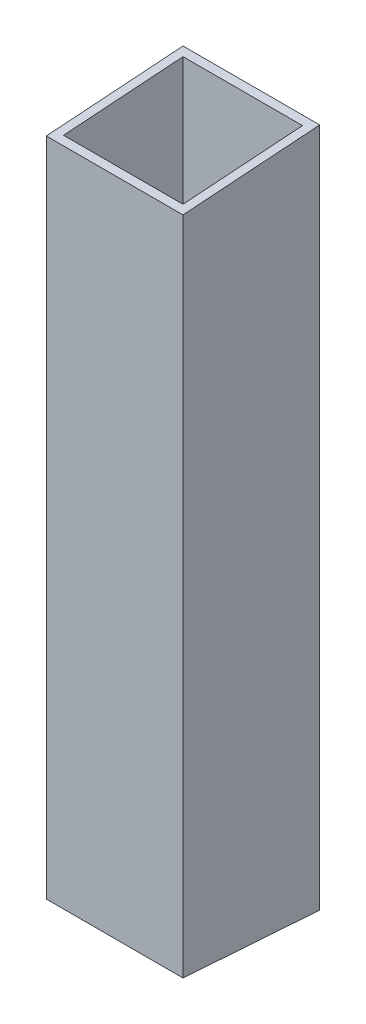
ISO-10303-21;
HEADER;
FILE_DESCRIPTION(('STEP AP214'),'2;1');
FILE_NAME('part.step','',(''),(''),'','','');
FILE_SCHEMA(('AUTOMOTIVE_DESIGN { 1 0 10303 214 1 1 1 1 }'));
ENDSEC;
DATA;
#1=APPLICATION_CONTEXT('core data for automotive mechanical design processes');
#2=APPLICATION_PROTOCOL_DEFINITION('international standard','automotive_design',2000,#1);
#3=PRODUCT_CONTEXT('',#1,'mechanical');
#4=PRODUCT('Part','Part','',(#3));
#5=PRODUCT_RELATED_PRODUCT_CATEGORY('part','',(#4));
#6=PRODUCT_DEFINITION_FORMATION('','',#4);
#7=PRODUCT_DEFINITION_CONTEXT('part definition',#1,'design');
#8=PRODUCT_DEFINITION('design','',#6,#7);
#9=PRODUCT_DEFINITION_SHAPE('','',#8);
#10=(LENGTH_UNIT() NAMED_UNIT(*) SI_UNIT(.MILLI.,.METRE.));
#11=(NAMED_UNIT(*) PLANE_ANGLE_UNIT() SI_UNIT($,.RADIAN.));
#12=(NAMED_UNIT(*) SI_UNIT($,.STERADIAN.) SOLID_ANGLE_UNIT());
#13=UNCERTAINTY_MEASURE_WITH_UNIT(LENGTH_MEASURE(1.E-05),#10,'distance_accuracy_value','');
#14=(GEOMETRIC_REPRESENTATION_CONTEXT(3) GLOBAL_UNCERTAINTY_ASSIGNED_CONTEXT((#13)) GLOBAL_UNIT_ASSIGNED_CONTEXT((#10,
#11,#12)) REPRESENTATION_CONTEXT('',''));
#15=CARTESIAN_POINT('',(0.,0.,0.));
#16=DIRECTION('',(0.,0.,1.));
#17=DIRECTION('',(1.,0.,0.));
#18=AXIS2_PLACEMENT_3D('',#15,#16,#17);
#19=CARTESIAN_POINT('',(9.525,92.1,9.525));
#20=DIRECTION('',(-1.,0.,0.));
#21=DIRECTION('',(0.,0.,1.));
#22=AXIS2_PLACEMENT_3D('',#19,#20,#21);
#23=PLANE('',#22);
#24=DIRECTION('',(0.,-1.,0.));
#25=VECTOR('',#24,1.);
#26=CARTESIAN_POINT('',(9.525,92.1,9.525));
#27=LINE('',#26,#25);
#28=CARTESIAN_POINT('',(9.525,92.1,9.525));
#29=VERTEX_POINT('',#28);
#30=CARTESIAN_POINT('',(9.525,0.,9.525));
#31=VERTEX_POINT('',#30);
#32=EDGE_CURVE('E161',#29,#31,#27,.T.);
#33=ORIENTED_EDGE('',*,*,#32,.T.);
#34=DIRECTION('',(0.,-0.0697564737441175,-0.997564050259825));
#35=VECTOR('',#34,1.);
#36=CARTESIAN_POINT('',(9.525,-1.33210576752373,-9.52500000000001));
#37=LINE('',#36,#35);
#38=CARTESIAN_POINT('',(9.525,-1.33210576752373,-9.52500000000001));
#39=VERTEX_POINT('',#38);
#40=EDGE_CURVE('E132',#31,#39,#37,.T.);
#41=ORIENTED_EDGE('',*,*,#40,.T.);
#42=DIRECTION('',(0.,-1.,0.));
#43=VECTOR('',#42,1.);
#44=CARTESIAN_POINT('',(9.525,92.1,-9.525));
#45=LINE('',#44,#43);
#46=CARTESIAN_POINT('',(9.525,93.4321057675237,-9.525));
#47=VERTEX_POINT('',#46);
#48=EDGE_CURVE('E175',#47,#39,#45,.T.);
#49=ORIENTED_EDGE('',*,*,#48,.F.);
#50=DIRECTION('',(0.,-0.069756473744119,0.997564050259825));
#51=VECTOR('',#50,1.);
#52=CARTESIAN_POINT('',(9.525,93.4321057675237,-9.525));
#53=LINE('',#52,#51);
#54=EDGE_CURVE('E144',#47,#29,#53,.T.);
#55=ORIENTED_EDGE('',*,*,#54,.T.);
#56=EDGE_LOOP('',(#33,#41,#49,#55));
#57=FACE_BOUND('',#56,.T.);
#58=ADVANCED_FACE('F39',(#57),#23,.F.);
#59=CARTESIAN_POINT('',(-9.525,92.1,-9.525));
#60=DIRECTION('',(0.,0.,1.));
#61=DIRECTION('',(1.,0.,0.));
#62=AXIS2_PLACEMENT_3D('',#59,#60,#61);
#63=PLANE('',#62);
#64=ORIENTED_EDGE('',*,*,#48,.T.);
#65=DIRECTION('',(1.,0.,0.));
#66=VECTOR('',#65,1.);
#67=CARTESIAN_POINT('',(-9.525,-1.33210576752373,-9.52500000000001));
#68=LINE('',#67,#66);
#69=CARTESIAN_POINT('',(-9.525,-1.33210576752373,-9.52500000000001));
#70=VERTEX_POINT('',#69);
#71=EDGE_CURVE('E137',#70,#39,#68,.T.);
#72=ORIENTED_EDGE('',*,*,#71,.F.);
#73=DIRECTION('',(0.,-1.,0.));
#74=VECTOR('',#73,1.);
#75=CARTESIAN_POINT('',(-9.525,92.1,-9.525));
#76=LINE('',#75,#74);
#77=CARTESIAN_POINT('',(-9.525,93.4321057675237,-9.525));
#78=VERTEX_POINT('',#77);
#79=EDGE_CURVE('E172',#78,#70,#76,.T.);
#80=ORIENTED_EDGE('',*,*,#79,.F.);
#81=DIRECTION('',(1.,0.,0.));
#82=VECTOR('',#81,1.);
#83=CARTESIAN_POINT('',(-9.525,93.4321057675237,-9.525));
#84=LINE('',#83,#82);
#85=EDGE_CURVE('E149',#78,#47,#84,.T.);
#86=ORIENTED_EDGE('',*,*,#85,.T.);
#87=EDGE_LOOP('',(#64,#72,#80,#86));
#88=FACE_BOUND('',#87,.T.);
#89=ADVANCED_FACE('F209',(#88),#63,.F.);
#90=CARTESIAN_POINT('',(-9.525,92.1,9.525));
#91=DIRECTION('',(1.,0.,0.));
#92=DIRECTION('',(0.,0.,-1.));
#93=AXIS2_PLACEMENT_3D('',#90,#91,#92);
#94=PLANE('',#93);
#95=ORIENTED_EDGE('',*,*,#79,.T.);
#96=DIRECTION('',(0.,-0.0697564737441175,-0.997564050259825));
#97=VECTOR('',#96,1.);
#98=CARTESIAN_POINT('',(-9.525,-1.33210576752373,-9.52500000000001));
#99=LINE('',#98,#97);
#100=CARTESIAN_POINT('',(-9.525,0.,9.525));
#101=VERTEX_POINT('',#100);
#102=EDGE_CURVE('E133',#101,#70,#99,.T.);
#103=ORIENTED_EDGE('',*,*,#102,.F.);
#104=DIRECTION('',(0.,-1.,0.));
#105=VECTOR('',#104,1.);
#106=CARTESIAN_POINT('',(-9.525,92.1,9.525));
#107=LINE('',#106,#105);
#108=CARTESIAN_POINT('',(-9.525,92.1,9.525));
#109=VERTEX_POINT('',#108);
#110=EDGE_CURVE('E168',#109,#101,#107,.T.);
#111=ORIENTED_EDGE('',*,*,#110,.F.);
#112=DIRECTION('',(0.,-0.069756473744119,0.997564050259825));
#113=VECTOR('',#112,1.);
#114=CARTESIAN_POINT('',(-9.525,93.4321057675237,-9.525));
#115=LINE('',#114,#113);
#116=EDGE_CURVE('E145',#78,#109,#115,.T.);
#117=ORIENTED_EDGE('',*,*,#116,.F.);
#118=EDGE_LOOP('',(#95,#103,#111,#117));
#119=FACE_BOUND('',#118,.T.);
#120=ADVANCED_FACE('F214',(#119),#94,.F.);
#121=CARTESIAN_POINT('',(-9.525,92.1,9.525));
#122=DIRECTION('',(0.,0.,-1.));
#123=DIRECTION('',(-1.,0.,0.));
#124=AXIS2_PLACEMENT_3D('',#121,#122,#123);
#125=PLANE('',#124);
#126=DIRECTION('',(1.,0.,0.));
#127=VECTOR('',#126,1.);
#128=CARTESIAN_POINT('',(-9.525,0.,9.525));
#129=LINE('',#128,#127);
#130=EDGE_CURVE('E156',#101,#31,#129,.T.);
#131=ORIENTED_EDGE('',*,*,#130,.T.);
#132=ORIENTED_EDGE('',*,*,#32,.F.);
#133=DIRECTION('',(1.,0.,0.));
#134=VECTOR('',#133,1.);
#135=CARTESIAN_POINT('',(-9.525,92.1,9.525));
#136=LINE('',#135,#134);
#137=EDGE_CURVE('E157',#109,#29,#136,.T.);
#138=ORIENTED_EDGE('',*,*,#137,.F.);
#139=ORIENTED_EDGE('',*,*,#110,.T.);
#140=EDGE_LOOP('',(#131,#132,#138,#139));
#141=FACE_BOUND('',#140,.T.);
#142=ADVANCED_FACE('F219',(#141),#125,.F.);
#143=CARTESIAN_POINT('',(-9.525,93.4321057675237,-9.525));
#144=DIRECTION('',(0.,0.997564050259825,0.069756473744119));
#145=DIRECTION('',(0.,-0.069756473744119,0.997564050259825));
#146=AXIS2_PLACEMENT_3D('',#143,#144,#145);
#147=PLANE('',#146);
#148=DIRECTION('',(1.,0.,0.));
#149=VECTOR('',#148,1.);
#150=CARTESIAN_POINT('',(-9.525,92.1839121743322,8.325));
#151=LINE('',#150,#149);
#152=CARTESIAN_POINT('',(-8.325,92.1839121743322,8.32500000000001));
#153=VERTEX_POINT('',#152);
#154=CARTESIAN_POINT('',(8.325,92.1839121743322,8.325));
#155=VERTEX_POINT('',#154);
#156=EDGE_CURVE('E126',#153,#155,#151,.T.);
#157=ORIENTED_EDGE('',*,*,#156,.F.);
#158=DIRECTION('',(0.,-0.069756473744119,0.997564050259825));
#159=VECTOR('',#158,1.);
#160=CARTESIAN_POINT('',(-8.325,93.4321057675237,-9.525));
#161=LINE('',#160,#159);
#162=CARTESIAN_POINT('',(-8.325,93.3481935931915,-8.325));
#163=VERTEX_POINT('',#162);
#164=EDGE_CURVE('E122',#163,#153,#161,.T.);
#165=ORIENTED_EDGE('',*,*,#164,.F.);
#166=DIRECTION('',(-1.,0.,0.));
#167=VECTOR('',#166,1.);
#168=CARTESIAN_POINT('',(-9.525,93.3481935931915,-8.325));
#169=LINE('',#168,#167);
#170=CARTESIAN_POINT('',(8.325,93.3481935931915,-8.325));
#171=VERTEX_POINT('',#170);
#172=EDGE_CURVE('E106',#171,#163,#169,.T.);
#173=ORIENTED_EDGE('',*,*,#172,.F.);
#174=DIRECTION('',(0.,0.069756473744119,-0.997564050259825));
#175=VECTOR('',#174,1.);
#176=CARTESIAN_POINT('',(8.325,93.4321057675237,-9.525));
#177=LINE('',#176,#175);
#178=EDGE_CURVE('E100',#155,#171,#177,.T.);
#179=ORIENTED_EDGE('',*,*,#178,.F.);
#180=EDGE_LOOP('',(#157,#165,#173,#179));
#181=FACE_BOUND('',#180,.T.);
#182=ORIENTED_EDGE('',*,*,#54,.F.);
#183=ORIENTED_EDGE('',*,*,#85,.F.);
#184=ORIENTED_EDGE('',*,*,#116,.T.);
#185=ORIENTED_EDGE('',*,*,#137,.T.);
#186=EDGE_LOOP('',(#182,#183,#184,#185));
#187=FACE_BOUND('',#186,.T.);
#188=ADVANCED_FACE('F120',(#181,#187),#147,.T.);
#189=CARTESIAN_POINT('',(-9.525,-1.33210576752373,-9.52500000000001));
#190=DIRECTION('',(0.,-0.997564050259825,0.0697564737441175));
#191=DIRECTION('',(0.,-0.0697564737441176,-0.997564050259825));
#192=AXIS2_PLACEMENT_3D('',#189,#190,#191);
#193=PLANE('',#192);
#194=DIRECTION('',(-1.,0.,0.));
#195=VECTOR('',#194,1.);
#196=CARTESIAN_POINT('',(-9.525,-0.083912174332203,8.32500000000001));
#197=LINE('',#196,#195);
#198=CARTESIAN_POINT('',(8.325,-0.0839121743322028,8.32500000000001));
#199=VERTEX_POINT('',#198);
#200=CARTESIAN_POINT('',(-8.325,-0.0839121743322028,8.32500000000001));
#201=VERTEX_POINT('',#200);
#202=EDGE_CURVE('E11',#199,#201,#197,.T.);
#203=ORIENTED_EDGE('',*,*,#202,.F.);
#204=DIRECTION('',(0.,0.0697564737441176,0.997564050259825));
#205=VECTOR('',#204,1.);
#206=CARTESIAN_POINT('',(8.325,-1.33210576752373,-9.52500000000001));
#207=LINE('',#206,#205);
#208=CARTESIAN_POINT('',(8.325,-1.24819359319152,-8.325));
#209=VERTEX_POINT('',#208);
#210=EDGE_CURVE('E178',#209,#199,#207,.T.);
#211=ORIENTED_EDGE('',*,*,#210,.F.);
#212=DIRECTION('',(1.,0.,0.));
#213=VECTOR('',#212,1.);
#214=CARTESIAN_POINT('',(-9.525,-1.24819359319152,-8.325));
#215=LINE('',#214,#213);
#216=CARTESIAN_POINT('',(-8.325,-1.24819359319152,-8.325));
#217=VERTEX_POINT('',#216);
#218=EDGE_CURVE('E114',#217,#209,#215,.T.);
#219=ORIENTED_EDGE('',*,*,#218,.F.);
#220=DIRECTION('',(0.,-0.0697564737441176,-0.997564050259825));
#221=VECTOR('',#220,1.);
#222=CARTESIAN_POINT('',(-8.325,-1.33210576752373,-9.52500000000001));
#223=LINE('',#222,#221);
#224=EDGE_CURVE('E47',#201,#217,#223,.T.);
#225=ORIENTED_EDGE('',*,*,#224,.F.);
#226=EDGE_LOOP('',(#203,#211,#219,#225));
#227=FACE_BOUND('',#226,.T.);
#228=ORIENTED_EDGE('',*,*,#40,.F.);
#229=ORIENTED_EDGE('',*,*,#130,.F.);
#230=ORIENTED_EDGE('',*,*,#102,.T.);
#231=ORIENTED_EDGE('',*,*,#71,.T.);
#232=EDGE_LOOP('',(#228,#229,#230,#231));
#233=FACE_BOUND('',#232,.T.);
#234=ADVANCED_FACE('F192',(#227,#233),#193,.T.);
#235=CARTESIAN_POINT('',(-8.325,-1.33210576752373,8.325));
#236=DIRECTION('',(0.,0.,1.));
#237=DIRECTION('',(1.,0.,0.));
#238=AXIS2_PLACEMENT_3D('',#235,#236,#237);
#239=PLANE('',#238);
#240=ORIENTED_EDGE('',*,*,#156,.T.);
#241=DIRECTION('',(0.,1.,0.));
#242=VECTOR('',#241,1.);
#243=CARTESIAN_POINT('',(8.325,-1.33210576752373,8.325));
#244=LINE('',#243,#242);
#245=EDGE_CURVE('E54',#199,#155,#244,.T.);
#246=ORIENTED_EDGE('',*,*,#245,.F.);
#247=ORIENTED_EDGE('',*,*,#202,.T.);
#248=DIRECTION('',(0.,1.,0.));
#249=VECTOR('',#248,1.);
#250=CARTESIAN_POINT('',(-8.325,-1.33210576752373,8.325));
#251=LINE('',#250,#249);
#252=EDGE_CURVE('E107',#201,#153,#251,.T.);
#253=ORIENTED_EDGE('',*,*,#252,.T.);
#254=EDGE_LOOP('',(#240,#246,#247,#253));
#255=FACE_BOUND('',#254,.T.);
#256=ADVANCED_FACE('F195',(#255),#239,.F.);
#257=CARTESIAN_POINT('',(-8.325,-1.33210576752373,-8.325));
#258=DIRECTION('',(-1.,0.,0.));
#259=DIRECTION('',(0.,0.,1.));
#260=AXIS2_PLACEMENT_3D('',#257,#258,#259);
#261=PLANE('',#260);
#262=ORIENTED_EDGE('',*,*,#164,.T.);
#263=ORIENTED_EDGE('',*,*,#252,.F.);
#264=ORIENTED_EDGE('',*,*,#224,.T.);
#265=DIRECTION('',(0.,1.,0.));
#266=VECTOR('',#265,1.);
#267=CARTESIAN_POINT('',(-8.325,-1.33210576752373,-8.325));
#268=LINE('',#267,#266);
#269=EDGE_CURVE('E117',#217,#163,#268,.T.);
#270=ORIENTED_EDGE('',*,*,#269,.T.);
#271=EDGE_LOOP('',(#262,#263,#264,#270));
#272=FACE_BOUND('',#271,.T.);
#273=ADVANCED_FACE('F186',(#272),#261,.F.);
#274=CARTESIAN_POINT('',(8.325,-1.33210576752373,-8.325));
#275=DIRECTION('',(0.,0.,-1.));
#276=DIRECTION('',(-1.,0.,0.));
#277=AXIS2_PLACEMENT_3D('',#274,#275,#276);
#278=PLANE('',#277);
#279=ORIENTED_EDGE('',*,*,#172,.T.);
#280=ORIENTED_EDGE('',*,*,#269,.F.);
#281=ORIENTED_EDGE('',*,*,#218,.T.);
#282=DIRECTION('',(0.,1.,0.));
#283=VECTOR('',#282,1.);
#284=CARTESIAN_POINT('',(8.325,-1.33210576752373,-8.325));
#285=LINE('',#284,#283);
#286=EDGE_CURVE('E59',#209,#171,#285,.T.);
#287=ORIENTED_EDGE('',*,*,#286,.T.);
#288=EDGE_LOOP('',(#279,#280,#281,#287));
#289=FACE_BOUND('',#288,.T.);
#290=ADVANCED_FACE('F110',(#289),#278,.F.);
#291=CARTESIAN_POINT('',(8.325,-1.33210576752373,8.325));
#292=DIRECTION('',(1.,0.,0.));
#293=DIRECTION('',(0.,0.,-1.));
#294=AXIS2_PLACEMENT_3D('',#291,#292,#293);
#295=PLANE('',#294);
#296=ORIENTED_EDGE('',*,*,#178,.T.);
#297=ORIENTED_EDGE('',*,*,#286,.F.);
#298=ORIENTED_EDGE('',*,*,#210,.T.);
#299=ORIENTED_EDGE('',*,*,#245,.T.);
#300=EDGE_LOOP('',(#296,#297,#298,#299));
#301=FACE_BOUND('',#300,.T.);
#302=ADVANCED_FACE('F101',(#301),#295,.F.);
#303=CLOSED_SHELL('',(#58,#89,#120,#142,#188,#234,#256,#273,#290,#302));
#304=MANIFOLD_SOLID_BREP('B2',#303);
#305=ADVANCED_BREP_SHAPE_REPRESENTATION('',(#18,#304),#14);
#306=SHAPE_DEFINITION_REPRESENTATION(#9,#305);
ENDSEC;
END-ISO-10303-21;
